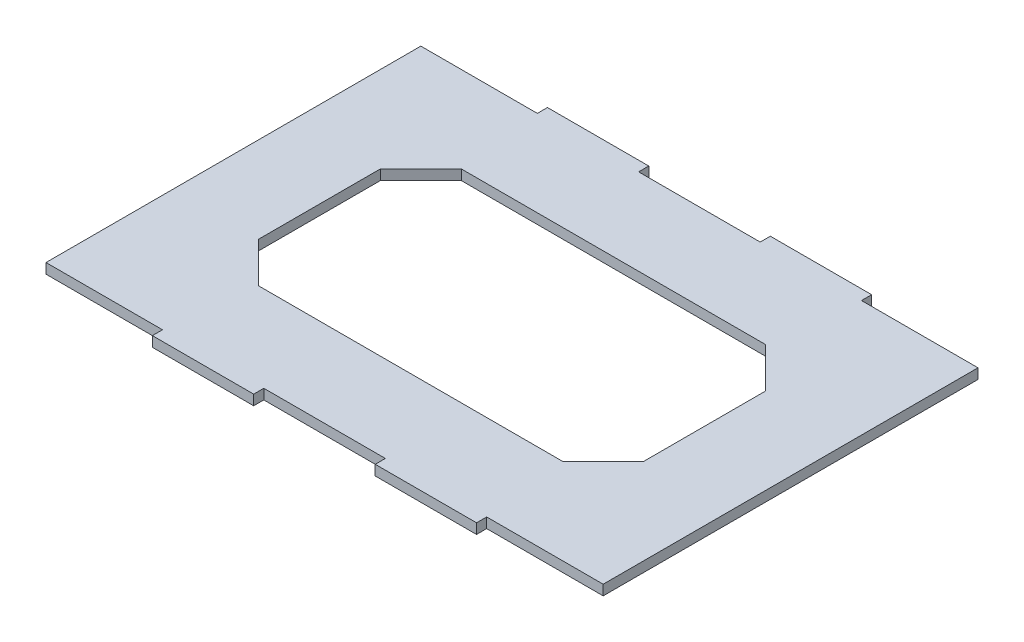
ISO-10303-21;
HEADER;
FILE_DESCRIPTION(('STEP AP214'),'2;1');
FILE_NAME('part.step','',(''),(''),'','','');
FILE_SCHEMA(('AUTOMOTIVE_DESIGN { 1 0 10303 214 1 1 1 1 }'));
ENDSEC;
DATA;
#1=APPLICATION_CONTEXT('core data for automotive mechanical design processes');
#2=APPLICATION_PROTOCOL_DEFINITION('international standard','automotive_design',2000,#1);
#3=PRODUCT_CONTEXT('',#1,'mechanical');
#4=PRODUCT('Part','Part','',(#3));
#5=PRODUCT_RELATED_PRODUCT_CATEGORY('part','',(#4));
#6=PRODUCT_DEFINITION_FORMATION('','',#4);
#7=PRODUCT_DEFINITION_CONTEXT('part definition',#1,'design');
#8=PRODUCT_DEFINITION('design','',#6,#7);
#9=PRODUCT_DEFINITION_SHAPE('','',#8);
#10=(LENGTH_UNIT() NAMED_UNIT(*) SI_UNIT(.MILLI.,.METRE.));
#11=(NAMED_UNIT(*) PLANE_ANGLE_UNIT() SI_UNIT($,.RADIAN.));
#12=(NAMED_UNIT(*) SI_UNIT($,.STERADIAN.) SOLID_ANGLE_UNIT());
#13=UNCERTAINTY_MEASURE_WITH_UNIT(LENGTH_MEASURE(1.E-05),#10,'distance_accuracy_value','');
#14=(GEOMETRIC_REPRESENTATION_CONTEXT(3) GLOBAL_UNCERTAINTY_ASSIGNED_CONTEXT((#13)) GLOBAL_UNIT_ASSIGNED_CONTEXT((#10,
#11,#12)) REPRESENTATION_CONTEXT('',''));
#15=CARTESIAN_POINT('',(0.,0.,0.));
#16=DIRECTION('',(0.,0.,1.));
#17=DIRECTION('',(1.,0.,0.));
#18=AXIS2_PLACEMENT_3D('',#15,#16,#17);
#19=CARTESIAN_POINT('',(0.,10.,0.));
#20=DIRECTION('',(0.,1.,0.));
#21=DIRECTION('',(0.,0.,1.));
#22=AXIS2_PLACEMENT_3D('',#19,#20,#21);
#23=PLANE('',#22);
#24=DIRECTION('',(0.,0.,-1.));
#25=VECTOR('',#24,1.);
#26=CARTESIAN_POINT('',(550.,10.,-380.));
#27=LINE('',#26,#25);
#28=CARTESIAN_POINT('',(550.,10.,-10.));
#29=VERTEX_POINT('',#28);
#30=CARTESIAN_POINT('',(550.,10.,-380.));
#31=VERTEX_POINT('',#30);
#32=EDGE_CURVE('E283',#29,#31,#27,.T.);
#33=ORIENTED_EDGE('',*,*,#32,.T.);
#34=DIRECTION('',(-1.,0.,0.));
#35=VECTOR('',#34,1.);
#36=CARTESIAN_POINT('',(435.,10.,-380.));
#37=LINE('',#36,#35);
#38=CARTESIAN_POINT('',(435.,10.,-380.));
#39=VERTEX_POINT('',#38);
#40=EDGE_CURVE('E286',#31,#39,#37,.T.);
#41=ORIENTED_EDGE('',*,*,#40,.T.);
#42=DIRECTION('',(0.,0.,-1.));
#43=VECTOR('',#42,1.);
#44=CARTESIAN_POINT('',(435.,10.,-390.));
#45=LINE('',#44,#43);
#46=CARTESIAN_POINT('',(435.,10.,-390.));
#47=VERTEX_POINT('',#46);
#48=EDGE_CURVE('E289',#39,#47,#45,.T.);
#49=ORIENTED_EDGE('',*,*,#48,.T.);
#50=DIRECTION('',(-1.,0.,0.));
#51=VECTOR('',#50,1.);
#52=CARTESIAN_POINT('',(335.,10.,-390.));
#53=LINE('',#52,#51);
#54=CARTESIAN_POINT('',(335.,10.,-390.));
#55=VERTEX_POINT('',#54);
#56=EDGE_CURVE('E291',#47,#55,#53,.T.);
#57=ORIENTED_EDGE('',*,*,#56,.T.);
#58=DIRECTION('',(0.,0.,1.));
#59=VECTOR('',#58,1.);
#60=CARTESIAN_POINT('',(335.,10.,-380.));
#61=LINE('',#60,#59);
#62=CARTESIAN_POINT('',(335.,10.,-380.));
#63=VERTEX_POINT('',#62);
#64=EDGE_CURVE('E293',#55,#63,#61,.T.);
#65=ORIENTED_EDGE('',*,*,#64,.T.);
#66=DIRECTION('',(-1.,0.,0.));
#67=VECTOR('',#66,1.);
#68=CARTESIAN_POINT('',(215.,10.,-380.));
#69=LINE('',#68,#67);
#70=CARTESIAN_POINT('',(215.,10.,-380.));
#71=VERTEX_POINT('',#70);
#72=EDGE_CURVE('E295',#63,#71,#69,.T.);
#73=ORIENTED_EDGE('',*,*,#72,.T.);
#74=DIRECTION('',(0.,0.,-1.));
#75=VECTOR('',#74,1.);
#76=CARTESIAN_POINT('',(215.,10.,-390.));
#77=LINE('',#76,#75);
#78=CARTESIAN_POINT('',(215.,10.,-390.));
#79=VERTEX_POINT('',#78);
#80=EDGE_CURVE('E297',#71,#79,#77,.T.);
#81=ORIENTED_EDGE('',*,*,#80,.T.);
#82=DIRECTION('',(-1.,0.,0.));
#83=VECTOR('',#82,1.);
#84=CARTESIAN_POINT('',(115.,10.,-390.));
#85=LINE('',#84,#83);
#86=CARTESIAN_POINT('',(115.,10.,-390.));
#87=VERTEX_POINT('',#86);
#88=EDGE_CURVE('E299',#79,#87,#85,.T.);
#89=ORIENTED_EDGE('',*,*,#88,.T.);
#90=DIRECTION('',(0.,0.,1.));
#91=VECTOR('',#90,1.);
#92=CARTESIAN_POINT('',(115.,10.,-380.));
#93=LINE('',#92,#91);
#94=CARTESIAN_POINT('',(115.,10.,-380.));
#95=VERTEX_POINT('',#94);
#96=EDGE_CURVE('E301',#87,#95,#93,.T.);
#97=ORIENTED_EDGE('',*,*,#96,.T.);
#98=DIRECTION('',(-1.,0.,0.));
#99=VECTOR('',#98,1.);
#100=CARTESIAN_POINT('',(-1.11022302462516E-13,10.,-380.));
#101=LINE('',#100,#99);
#102=CARTESIAN_POINT('',(-1.11022302462516E-13,10.,-380.));
#103=VERTEX_POINT('',#102);
#104=EDGE_CURVE('E303',#95,#103,#101,.T.);
#105=ORIENTED_EDGE('',*,*,#104,.T.);
#106=DIRECTION('',(0.,0.,1.));
#107=VECTOR('',#106,1.);
#108=CARTESIAN_POINT('',(0.,10.,-9.99999999999997));
#109=LINE('',#108,#107);
#110=CARTESIAN_POINT('',(0.,10.,-9.99999999999997));
#111=VERTEX_POINT('',#110);
#112=EDGE_CURVE('E305',#103,#111,#109,.T.);
#113=ORIENTED_EDGE('',*,*,#112,.T.);
#114=DIRECTION('',(1.,0.,0.));
#115=VECTOR('',#114,1.);
#116=CARTESIAN_POINT('',(0.,10.,-9.99999999999997));
#117=LINE('',#116,#115);
#118=CARTESIAN_POINT('',(115.,10.,-10.));
#119=VERTEX_POINT('',#118);
#120=EDGE_CURVE('E307',#111,#119,#117,.T.);
#121=ORIENTED_EDGE('',*,*,#120,.T.);
#122=DIRECTION('',(0.,0.,1.));
#123=VECTOR('',#122,1.);
#124=CARTESIAN_POINT('',(115.,10.,-10.));
#125=LINE('',#124,#123);
#126=CARTESIAN_POINT('',(115.,10.,0.));
#127=VERTEX_POINT('',#126);
#128=EDGE_CURVE('E309',#119,#127,#125,.T.);
#129=ORIENTED_EDGE('',*,*,#128,.T.);
#130=DIRECTION('',(1.,0.,0.));
#131=VECTOR('',#130,1.);
#132=CARTESIAN_POINT('',(115.,10.,0.));
#133=LINE('',#132,#131);
#134=CARTESIAN_POINT('',(215.,10.,0.));
#135=VERTEX_POINT('',#134);
#136=EDGE_CURVE('E311',#127,#135,#133,.T.);
#137=ORIENTED_EDGE('',*,*,#136,.T.);
#138=DIRECTION('',(0.,0.,-1.));
#139=VECTOR('',#138,1.);
#140=CARTESIAN_POINT('',(215.,10.,0.));
#141=LINE('',#140,#139);
#142=CARTESIAN_POINT('',(215.,10.,-9.99999999999996));
#143=VERTEX_POINT('',#142);
#144=EDGE_CURVE('E313',#135,#143,#141,.T.);
#145=ORIENTED_EDGE('',*,*,#144,.T.);
#146=DIRECTION('',(1.,0.,0.));
#147=VECTOR('',#146,1.);
#148=CARTESIAN_POINT('',(215.,10.,-9.99999999999996));
#149=LINE('',#148,#147);
#150=CARTESIAN_POINT('',(335.,10.,-9.99999999999997));
#151=VERTEX_POINT('',#150);
#152=EDGE_CURVE('E315',#143,#151,#149,.T.);
#153=ORIENTED_EDGE('',*,*,#152,.T.);
#154=DIRECTION('',(0.,0.,1.));
#155=VECTOR('',#154,1.);
#156=CARTESIAN_POINT('',(335.,10.,-9.99999999999997));
#157=LINE('',#156,#155);
#158=CARTESIAN_POINT('',(335.,10.,0.));
#159=VERTEX_POINT('',#158);
#160=EDGE_CURVE('E317',#151,#159,#157,.T.);
#161=ORIENTED_EDGE('',*,*,#160,.T.);
#162=DIRECTION('',(1.,0.,0.));
#163=VECTOR('',#162,1.);
#164=CARTESIAN_POINT('',(335.,10.,0.));
#165=LINE('',#164,#163);
#166=CARTESIAN_POINT('',(435.,10.,0.));
#167=VERTEX_POINT('',#166);
#168=EDGE_CURVE('E319',#159,#167,#165,.T.);
#169=ORIENTED_EDGE('',*,*,#168,.T.);
#170=DIRECTION('',(0.,0.,-1.));
#171=VECTOR('',#170,1.);
#172=CARTESIAN_POINT('',(435.,10.,0.));
#173=LINE('',#172,#171);
#174=CARTESIAN_POINT('',(435.,10.,-9.99999999999999));
#175=VERTEX_POINT('',#174);
#176=EDGE_CURVE('E321',#167,#175,#173,.T.);
#177=ORIENTED_EDGE('',*,*,#176,.T.);
#178=DIRECTION('',(1.,0.,0.));
#179=VECTOR('',#178,1.);
#180=CARTESIAN_POINT('',(435.,10.,-9.99999999999999));
#181=LINE('',#180,#179);
#182=EDGE_CURVE('E323',#175,#29,#181,.T.);
#183=ORIENTED_EDGE('',*,*,#182,.T.);
#184=EDGE_LOOP('',(#33,#41,#49,#57,#65,#73,#81,#89,#97,#105,#113,#121,#129,#137,#145,#153,#161,
#169,#177,#183));
#185=FACE_BOUND('',#184,.T.);
#186=DIRECTION('',(0.707106781186547,0.,-0.707106781186548));
#187=VECTOR('',#186,1.);
#188=CARTESIAN_POINT('',(425.,10.,-95.));
#189=LINE('',#188,#187);
#190=CARTESIAN_POINT('',(425.,10.,-95.));
#191=VERTEX_POINT('',#190);
#192=CARTESIAN_POINT('',(465.,10.,-135.));
#193=VERTEX_POINT('',#192);
#194=EDGE_CURVE('E226',#191,#193,#189,.T.);
#195=ORIENTED_EDGE('',*,*,#194,.F.);
#196=DIRECTION('',(1.,0.,0.));
#197=VECTOR('',#196,1.);
#198=CARTESIAN_POINT('',(125.,10.,-95.));
#199=LINE('',#198,#197);
#200=CARTESIAN_POINT('',(125.,10.,-95.));
#201=VERTEX_POINT('',#200);
#202=EDGE_CURVE('E218',#201,#191,#199,.T.);
#203=ORIENTED_EDGE('',*,*,#202,.F.);
#204=DIRECTION('',(0.707106781186547,0.,0.707106781186548));
#205=VECTOR('',#204,1.);
#206=CARTESIAN_POINT('',(85.,10.,-135.));
#207=LINE('',#206,#205);
#208=CARTESIAN_POINT('',(85.,10.,-135.));
#209=VERTEX_POINT('',#208);
#210=EDGE_CURVE('E251',#209,#201,#207,.T.);
#211=ORIENTED_EDGE('',*,*,#210,.F.);
#212=DIRECTION('',(0.,0.,1.));
#213=VECTOR('',#212,1.);
#214=CARTESIAN_POINT('',(85.,10.,-255.));
#215=LINE('',#214,#213);
#216=CARTESIAN_POINT('',(85.,10.,-255.));
#217=VERTEX_POINT('',#216);
#218=EDGE_CURVE('E249',#217,#209,#215,.T.);
#219=ORIENTED_EDGE('',*,*,#218,.F.);
#220=DIRECTION('',(-0.707106781186548,0.,0.707106781186547));
#221=VECTOR('',#220,1.);
#222=CARTESIAN_POINT('',(85.,10.,-255.));
#223=LINE('',#222,#221);
#224=CARTESIAN_POINT('',(125.,10.,-295.));
#225=VERTEX_POINT('',#224);
#226=EDGE_CURVE('E247',#225,#217,#223,.T.);
#227=ORIENTED_EDGE('',*,*,#226,.F.);
#228=DIRECTION('',(-1.,0.,0.));
#229=VECTOR('',#228,1.);
#230=CARTESIAN_POINT('',(125.,10.,-295.));
#231=LINE('',#230,#229);
#232=CARTESIAN_POINT('',(425.,10.,-295.));
#233=VERTEX_POINT('',#232);
#234=EDGE_CURVE('E245',#233,#225,#231,.T.);
#235=ORIENTED_EDGE('',*,*,#234,.F.);
#236=DIRECTION('',(-0.707106781186547,0.,-0.707106781186547));
#237=VECTOR('',#236,1.);
#238=CARTESIAN_POINT('',(425.,10.,-295.));
#239=LINE('',#238,#237);
#240=CARTESIAN_POINT('',(465.,10.,-255.));
#241=VERTEX_POINT('',#240);
#242=EDGE_CURVE('E241',#241,#233,#239,.T.);
#243=ORIENTED_EDGE('',*,*,#242,.F.);
#244=DIRECTION('',(0.,0.,-1.));
#245=VECTOR('',#244,1.);
#246=CARTESIAN_POINT('',(465.,10.,-255.));
#247=LINE('',#246,#245);
#248=EDGE_CURVE('E239',#193,#241,#247,.T.);
#249=ORIENTED_EDGE('',*,*,#248,.F.);
#250=EDGE_LOOP('',(#195,#203,#211,#219,#227,#235,#243,#249));
#251=FACE_BOUND('',#250,.T.);
#252=ADVANCED_FACE('F33',(#185,#251),#23,.T.);
#253=CARTESIAN_POINT('',(0.,0.,0.));
#254=DIRECTION('',(0.,1.,0.));
#255=DIRECTION('',(0.,0.,1.));
#256=AXIS2_PLACEMENT_3D('',#253,#254,#255);
#257=PLANE('',#256);
#258=DIRECTION('',(0.,0.,-1.));
#259=VECTOR('',#258,1.);
#260=CARTESIAN_POINT('',(550.,0.,-380.));
#261=LINE('',#260,#259);
#262=CARTESIAN_POINT('',(550.,0.,-10.));
#263=VERTEX_POINT('',#262);
#264=CARTESIAN_POINT('',(550.,0.,-380.));
#265=VERTEX_POINT('',#264);
#266=EDGE_CURVE('E234',#263,#265,#261,.T.);
#267=ORIENTED_EDGE('',*,*,#266,.F.);
#268=DIRECTION('',(1.,0.,0.));
#269=VECTOR('',#268,1.);
#270=CARTESIAN_POINT('',(435.,0.,-9.99999999999999));
#271=LINE('',#270,#269);
#272=CARTESIAN_POINT('',(435.,0.,-9.99999999999999));
#273=VERTEX_POINT('',#272);
#274=EDGE_CURVE('E287',#273,#263,#271,.T.);
#275=ORIENTED_EDGE('',*,*,#274,.F.);
#276=DIRECTION('',(0.,0.,-1.));
#277=VECTOR('',#276,1.);
#278=CARTESIAN_POINT('',(435.,0.,0.));
#279=LINE('',#278,#277);
#280=CARTESIAN_POINT('',(435.,0.,0.));
#281=VERTEX_POINT('',#280);
#282=EDGE_CURVE('E362',#281,#273,#279,.T.);
#283=ORIENTED_EDGE('',*,*,#282,.F.);
#284=DIRECTION('',(1.,0.,0.));
#285=VECTOR('',#284,1.);
#286=CARTESIAN_POINT('',(335.,0.,0.));
#287=LINE('',#286,#285);
#288=CARTESIAN_POINT('',(335.,0.,0.));
#289=VERTEX_POINT('',#288);
#290=EDGE_CURVE('E360',#289,#281,#287,.T.);
#291=ORIENTED_EDGE('',*,*,#290,.F.);
#292=DIRECTION('',(0.,0.,1.));
#293=VECTOR('',#292,1.);
#294=CARTESIAN_POINT('',(335.,0.,-9.99999999999997));
#295=LINE('',#294,#293);
#296=CARTESIAN_POINT('',(335.,0.,-9.99999999999997));
#297=VERTEX_POINT('',#296);
#298=EDGE_CURVE('E358',#297,#289,#295,.T.);
#299=ORIENTED_EDGE('',*,*,#298,.F.);
#300=DIRECTION('',(1.,0.,0.));
#301=VECTOR('',#300,1.);
#302=CARTESIAN_POINT('',(215.,0.,-9.99999999999996));
#303=LINE('',#302,#301);
#304=CARTESIAN_POINT('',(215.,0.,-9.99999999999996));
#305=VERTEX_POINT('',#304);
#306=EDGE_CURVE('E356',#305,#297,#303,.T.);
#307=ORIENTED_EDGE('',*,*,#306,.F.);
#308=DIRECTION('',(0.,0.,-1.));
#309=VECTOR('',#308,1.);
#310=CARTESIAN_POINT('',(215.,0.,0.));
#311=LINE('',#310,#309);
#312=CARTESIAN_POINT('',(215.,0.,0.));
#313=VERTEX_POINT('',#312);
#314=EDGE_CURVE('E354',#313,#305,#311,.T.);
#315=ORIENTED_EDGE('',*,*,#314,.F.);
#316=DIRECTION('',(1.,0.,0.));
#317=VECTOR('',#316,1.);
#318=CARTESIAN_POINT('',(115.,0.,0.));
#319=LINE('',#318,#317);
#320=CARTESIAN_POINT('',(115.,0.,0.));
#321=VERTEX_POINT('',#320);
#322=EDGE_CURVE('E352',#321,#313,#319,.T.);
#323=ORIENTED_EDGE('',*,*,#322,.F.);
#324=DIRECTION('',(0.,0.,1.));
#325=VECTOR('',#324,1.);
#326=CARTESIAN_POINT('',(115.,0.,-10.));
#327=LINE('',#326,#325);
#328=CARTESIAN_POINT('',(115.,0.,-10.));
#329=VERTEX_POINT('',#328);
#330=EDGE_CURVE('E350',#329,#321,#327,.T.);
#331=ORIENTED_EDGE('',*,*,#330,.F.);
#332=DIRECTION('',(1.,0.,0.));
#333=VECTOR('',#332,1.);
#334=CARTESIAN_POINT('',(0.,0.,-9.99999999999997));
#335=LINE('',#334,#333);
#336=CARTESIAN_POINT('',(0.,0.,-9.99999999999997));
#337=VERTEX_POINT('',#336);
#338=EDGE_CURVE('E348',#337,#329,#335,.T.);
#339=ORIENTED_EDGE('',*,*,#338,.F.);
#340=DIRECTION('',(0.,0.,1.));
#341=VECTOR('',#340,1.);
#342=CARTESIAN_POINT('',(0.,0.,-9.99999999999997));
#343=LINE('',#342,#341);
#344=CARTESIAN_POINT('',(-1.11022302462516E-13,0.,-380.));
#345=VERTEX_POINT('',#344);
#346=EDGE_CURVE('E346',#345,#337,#343,.T.);
#347=ORIENTED_EDGE('',*,*,#346,.F.);
#348=DIRECTION('',(-1.,0.,0.));
#349=VECTOR('',#348,1.);
#350=CARTESIAN_POINT('',(-1.11022302462516E-13,0.,-380.));
#351=LINE('',#350,#349);
#352=CARTESIAN_POINT('',(115.,0.,-380.));
#353=VERTEX_POINT('',#352);
#354=EDGE_CURVE('E344',#353,#345,#351,.T.);
#355=ORIENTED_EDGE('',*,*,#354,.F.);
#356=DIRECTION('',(0.,0.,1.));
#357=VECTOR('',#356,1.);
#358=CARTESIAN_POINT('',(115.,0.,-380.));
#359=LINE('',#358,#357);
#360=CARTESIAN_POINT('',(115.,0.,-390.));
#361=VERTEX_POINT('',#360);
#362=EDGE_CURVE('E342',#361,#353,#359,.T.);
#363=ORIENTED_EDGE('',*,*,#362,.F.);
#364=DIRECTION('',(-1.,0.,0.));
#365=VECTOR('',#364,1.);
#366=CARTESIAN_POINT('',(115.,0.,-390.));
#367=LINE('',#366,#365);
#368=CARTESIAN_POINT('',(215.,0.,-390.));
#369=VERTEX_POINT('',#368);
#370=EDGE_CURVE('E340',#369,#361,#367,.T.);
#371=ORIENTED_EDGE('',*,*,#370,.F.);
#372=DIRECTION('',(0.,0.,-1.));
#373=VECTOR('',#372,1.);
#374=CARTESIAN_POINT('',(215.,0.,-390.));
#375=LINE('',#374,#373);
#376=CARTESIAN_POINT('',(215.,0.,-380.));
#377=VERTEX_POINT('',#376);
#378=EDGE_CURVE('E338',#377,#369,#375,.T.);
#379=ORIENTED_EDGE('',*,*,#378,.F.);
#380=DIRECTION('',(-1.,0.,0.));
#381=VECTOR('',#380,1.);
#382=CARTESIAN_POINT('',(215.,0.,-380.));
#383=LINE('',#382,#381);
#384=CARTESIAN_POINT('',(335.,0.,-380.));
#385=VERTEX_POINT('',#384);
#386=EDGE_CURVE('E336',#385,#377,#383,.T.);
#387=ORIENTED_EDGE('',*,*,#386,.F.);
#388=DIRECTION('',(0.,0.,1.));
#389=VECTOR('',#388,1.);
#390=CARTESIAN_POINT('',(335.,0.,-380.));
#391=LINE('',#390,#389);
#392=CARTESIAN_POINT('',(335.,0.,-390.));
#393=VERTEX_POINT('',#392);
#394=EDGE_CURVE('E334',#393,#385,#391,.T.);
#395=ORIENTED_EDGE('',*,*,#394,.F.);
#396=DIRECTION('',(-1.,0.,0.));
#397=VECTOR('',#396,1.);
#398=CARTESIAN_POINT('',(335.,0.,-390.));
#399=LINE('',#398,#397);
#400=CARTESIAN_POINT('',(435.,0.,-390.));
#401=VERTEX_POINT('',#400);
#402=EDGE_CURVE('E332',#401,#393,#399,.T.);
#403=ORIENTED_EDGE('',*,*,#402,.F.);
#404=DIRECTION('',(0.,0.,-1.));
#405=VECTOR('',#404,1.);
#406=CARTESIAN_POINT('',(435.,0.,-390.));
#407=LINE('',#406,#405);
#408=CARTESIAN_POINT('',(435.,0.,-380.));
#409=VERTEX_POINT('',#408);
#410=EDGE_CURVE('E330',#409,#401,#407,.T.);
#411=ORIENTED_EDGE('',*,*,#410,.F.);
#412=DIRECTION('',(-1.,0.,0.));
#413=VECTOR('',#412,1.);
#414=CARTESIAN_POINT('',(435.,0.,-380.));
#415=LINE('',#414,#413);
#416=EDGE_CURVE('E328',#265,#409,#415,.T.);
#417=ORIENTED_EDGE('',*,*,#416,.F.);
#418=EDGE_LOOP('',(#267,#275,#283,#291,#299,#307,#315,#323,#331,#339,#347,#355,#363,#371,#379,
#387,#395,#403,#411,#417));
#419=FACE_BOUND('',#418,.T.);
#420=DIRECTION('',(1.,0.,0.));
#421=VECTOR('',#420,1.);
#422=CARTESIAN_POINT('',(125.,0.,-95.));
#423=LINE('',#422,#421);
#424=CARTESIAN_POINT('',(125.,0.,-95.));
#425=VERTEX_POINT('',#424);
#426=CARTESIAN_POINT('',(425.,0.,-95.));
#427=VERTEX_POINT('',#426);
#428=EDGE_CURVE('E56',#425,#427,#423,.T.);
#429=ORIENTED_EDGE('',*,*,#428,.T.);
#430=DIRECTION('',(0.707106781186547,0.,-0.707106781186548));
#431=VECTOR('',#430,1.);
#432=CARTESIAN_POINT('',(425.,0.,-95.));
#433=LINE('',#432,#431);
#434=CARTESIAN_POINT('',(465.,0.,-135.));
#435=VERTEX_POINT('',#434);
#436=EDGE_CURVE('E233',#427,#435,#433,.T.);
#437=ORIENTED_EDGE('',*,*,#436,.T.);
#438=DIRECTION('',(0.,0.,-1.));
#439=VECTOR('',#438,1.);
#440=CARTESIAN_POINT('',(465.,0.,-255.));
#441=LINE('',#440,#439);
#442=CARTESIAN_POINT('',(465.,0.,-255.));
#443=VERTEX_POINT('',#442);
#444=EDGE_CURVE('E255',#435,#443,#441,.T.);
#445=ORIENTED_EDGE('',*,*,#444,.T.);
#446=DIRECTION('',(-0.707106781186547,0.,-0.707106781186547));
#447=VECTOR('',#446,1.);
#448=CARTESIAN_POINT('',(425.,0.,-295.));
#449=LINE('',#448,#447);
#450=CARTESIAN_POINT('',(425.,0.,-295.));
#451=VERTEX_POINT('',#450);
#452=EDGE_CURVE('E258',#443,#451,#449,.T.);
#453=ORIENTED_EDGE('',*,*,#452,.T.);
#454=DIRECTION('',(-1.,0.,0.));
#455=VECTOR('',#454,1.);
#456=CARTESIAN_POINT('',(125.,0.,-295.));
#457=LINE('',#456,#455);
#458=CARTESIAN_POINT('',(125.,0.,-295.));
#459=VERTEX_POINT('',#458);
#460=EDGE_CURVE('E261',#451,#459,#457,.T.);
#461=ORIENTED_EDGE('',*,*,#460,.T.);
#462=DIRECTION('',(-0.707106781186548,0.,0.707106781186547));
#463=VECTOR('',#462,1.);
#464=CARTESIAN_POINT('',(85.,0.,-255.));
#465=LINE('',#464,#463);
#466=CARTESIAN_POINT('',(85.,0.,-255.));
#467=VERTEX_POINT('',#466);
#468=EDGE_CURVE('E264',#459,#467,#465,.T.);
#469=ORIENTED_EDGE('',*,*,#468,.T.);
#470=DIRECTION('',(0.,0.,1.));
#471=VECTOR('',#470,1.);
#472=CARTESIAN_POINT('',(85.,0.,-255.));
#473=LINE('',#472,#471);
#474=CARTESIAN_POINT('',(85.,0.,-135.));
#475=VERTEX_POINT('',#474);
#476=EDGE_CURVE('E267',#467,#475,#473,.T.);
#477=ORIENTED_EDGE('',*,*,#476,.T.);
#478=DIRECTION('',(0.707106781186547,0.,0.707106781186548));
#479=VECTOR('',#478,1.);
#480=CARTESIAN_POINT('',(85.,0.,-135.));
#481=LINE('',#480,#479);
#482=EDGE_CURVE('E227',#475,#425,#481,.T.);
#483=ORIENTED_EDGE('',*,*,#482,.T.);
#484=EDGE_LOOP('',(#429,#437,#445,#453,#461,#469,#477,#483));
#485=FACE_BOUND('',#484,.T.);
#486=ADVANCED_FACE('F428',(#419,#485),#257,.F.);
#487=CARTESIAN_POINT('',(550.,10.,-380.));
#488=DIRECTION('',(-1.,0.,0.));
#489=DIRECTION('',(0.,0.,1.));
#490=AXIS2_PLACEMENT_3D('',#487,#488,#489);
#491=PLANE('',#490);
#492=ORIENTED_EDGE('',*,*,#266,.T.);
#493=DIRECTION('',(0.,-1.,0.));
#494=VECTOR('',#493,1.);
#495=CARTESIAN_POINT('',(550.,10.,-380.));
#496=LINE('',#495,#494);
#497=EDGE_CURVE('E11',#31,#265,#496,.T.);
#498=ORIENTED_EDGE('',*,*,#497,.F.);
#499=ORIENTED_EDGE('',*,*,#32,.F.);
#500=DIRECTION('',(0.,-1.,0.));
#501=VECTOR('',#500,1.);
#502=CARTESIAN_POINT('',(550.,10.,-10.));
#503=LINE('',#502,#501);
#504=EDGE_CURVE('E325',#29,#263,#503,.T.);
#505=ORIENTED_EDGE('',*,*,#504,.T.);
#506=EDGE_LOOP('',(#492,#498,#499,#505));
#507=FACE_BOUND('',#506,.T.);
#508=ADVANCED_FACE('F35',(#507),#491,.F.);
#509=CARTESIAN_POINT('',(435.,10.,-380.));
#510=DIRECTION('',(0.,0.,1.));
#511=DIRECTION('',(1.,0.,0.));
#512=AXIS2_PLACEMENT_3D('',#509,#510,#511);
#513=PLANE('',#512);
#514=ORIENTED_EDGE('',*,*,#416,.T.);
#515=DIRECTION('',(0.,-1.,0.));
#516=VECTOR('',#515,1.);
#517=CARTESIAN_POINT('',(435.,10.,-380.));
#518=LINE('',#517,#516);
#519=EDGE_CURVE('E41',#39,#409,#518,.T.);
#520=ORIENTED_EDGE('',*,*,#519,.F.);
#521=ORIENTED_EDGE('',*,*,#40,.F.);
#522=ORIENTED_EDGE('',*,*,#497,.T.);
#523=EDGE_LOOP('',(#514,#520,#521,#522));
#524=FACE_BOUND('',#523,.T.);
#525=ADVANCED_FACE('F445',(#524),#513,.F.);
#526=CARTESIAN_POINT('',(435.,10.,-390.));
#527=DIRECTION('',(-1.,0.,0.));
#528=DIRECTION('',(0.,0.,1.));
#529=AXIS2_PLACEMENT_3D('',#526,#527,#528);
#530=PLANE('',#529);
#531=ORIENTED_EDGE('',*,*,#410,.T.);
#532=DIRECTION('',(0.,-1.,0.));
#533=VECTOR('',#532,1.);
#534=CARTESIAN_POINT('',(435.,10.,-390.));
#535=LINE('',#534,#533);
#536=EDGE_CURVE('E415',#47,#401,#535,.T.);
#537=ORIENTED_EDGE('',*,*,#536,.F.);
#538=ORIENTED_EDGE('',*,*,#48,.F.);
#539=ORIENTED_EDGE('',*,*,#519,.T.);
#540=EDGE_LOOP('',(#531,#537,#538,#539));
#541=FACE_BOUND('',#540,.T.);
#542=ADVANCED_FACE('F422',(#541),#530,.F.);
#543=CARTESIAN_POINT('',(335.,10.,-390.));
#544=DIRECTION('',(0.,0.,1.));
#545=DIRECTION('',(1.,0.,0.));
#546=AXIS2_PLACEMENT_3D('',#543,#544,#545);
#547=PLANE('',#546);
#548=ORIENTED_EDGE('',*,*,#402,.T.);
#549=DIRECTION('',(0.,-1.,0.));
#550=VECTOR('',#549,1.);
#551=CARTESIAN_POINT('',(335.,10.,-390.));
#552=LINE('',#551,#550);
#553=EDGE_CURVE('E412',#55,#393,#552,.T.);
#554=ORIENTED_EDGE('',*,*,#553,.F.);
#555=ORIENTED_EDGE('',*,*,#56,.F.);
#556=ORIENTED_EDGE('',*,*,#536,.T.);
#557=EDGE_LOOP('',(#548,#554,#555,#556));
#558=FACE_BOUND('',#557,.T.);
#559=ADVANCED_FACE('F434',(#558),#547,.F.);
#560=CARTESIAN_POINT('',(335.,10.,-380.));
#561=DIRECTION('',(1.,0.,0.));
#562=DIRECTION('',(0.,0.,-1.));
#563=AXIS2_PLACEMENT_3D('',#560,#561,#562);
#564=PLANE('',#563);
#565=ORIENTED_EDGE('',*,*,#394,.T.);
#566=DIRECTION('',(0.,-1.,0.));
#567=VECTOR('',#566,1.);
#568=CARTESIAN_POINT('',(335.,10.,-380.));
#569=LINE('',#568,#567);
#570=EDGE_CURVE('E409',#63,#385,#569,.T.);
#571=ORIENTED_EDGE('',*,*,#570,.F.);
#572=ORIENTED_EDGE('',*,*,#64,.F.);
#573=ORIENTED_EDGE('',*,*,#553,.T.);
#574=EDGE_LOOP('',(#565,#571,#572,#573));
#575=FACE_BOUND('',#574,.T.);
#576=ADVANCED_FACE('F438',(#575),#564,.F.);
#577=CARTESIAN_POINT('',(215.,10.,-380.));
#578=DIRECTION('',(0.,0.,1.));
#579=DIRECTION('',(1.,0.,0.));
#580=AXIS2_PLACEMENT_3D('',#577,#578,#579);
#581=PLANE('',#580);
#582=ORIENTED_EDGE('',*,*,#386,.T.);
#583=DIRECTION('',(0.,-1.,0.));
#584=VECTOR('',#583,1.);
#585=CARTESIAN_POINT('',(215.,10.,-380.));
#586=LINE('',#585,#584);
#587=EDGE_CURVE('E406',#71,#377,#586,.T.);
#588=ORIENTED_EDGE('',*,*,#587,.F.);
#589=ORIENTED_EDGE('',*,*,#72,.F.);
#590=ORIENTED_EDGE('',*,*,#570,.T.);
#591=EDGE_LOOP('',(#582,#588,#589,#590));
#592=FACE_BOUND('',#591,.T.);
#593=ADVANCED_FACE('F518',(#592),#581,.F.);
#594=CARTESIAN_POINT('',(215.,10.,-390.));
#595=DIRECTION('',(-1.,0.,0.));
#596=DIRECTION('',(0.,0.,1.));
#597=AXIS2_PLACEMENT_3D('',#594,#595,#596);
#598=PLANE('',#597);
#599=ORIENTED_EDGE('',*,*,#378,.T.);
#600=DIRECTION('',(0.,-1.,0.));
#601=VECTOR('',#600,1.);
#602=CARTESIAN_POINT('',(215.,10.,-390.));
#603=LINE('',#602,#601);
#604=EDGE_CURVE('E403',#79,#369,#603,.T.);
#605=ORIENTED_EDGE('',*,*,#604,.F.);
#606=ORIENTED_EDGE('',*,*,#80,.F.);
#607=ORIENTED_EDGE('',*,*,#587,.T.);
#608=EDGE_LOOP('',(#599,#605,#606,#607));
#609=FACE_BOUND('',#608,.T.);
#610=ADVANCED_FACE('F516',(#609),#598,.F.);
#611=CARTESIAN_POINT('',(115.,10.,-390.));
#612=DIRECTION('',(0.,0.,1.));
#613=DIRECTION('',(1.,0.,0.));
#614=AXIS2_PLACEMENT_3D('',#611,#612,#613);
#615=PLANE('',#614);
#616=ORIENTED_EDGE('',*,*,#370,.T.);
#617=DIRECTION('',(0.,-1.,0.));
#618=VECTOR('',#617,1.);
#619=CARTESIAN_POINT('',(115.,10.,-390.));
#620=LINE('',#619,#618);
#621=EDGE_CURVE('E400',#87,#361,#620,.T.);
#622=ORIENTED_EDGE('',*,*,#621,.F.);
#623=ORIENTED_EDGE('',*,*,#88,.F.);
#624=ORIENTED_EDGE('',*,*,#604,.T.);
#625=EDGE_LOOP('',(#616,#622,#623,#624));
#626=FACE_BOUND('',#625,.T.);
#627=ADVANCED_FACE('F511',(#626),#615,.F.);
#628=CARTESIAN_POINT('',(115.,10.,-380.));
#629=DIRECTION('',(1.,0.,0.));
#630=DIRECTION('',(0.,0.,-1.));
#631=AXIS2_PLACEMENT_3D('',#628,#629,#630);
#632=PLANE('',#631);
#633=ORIENTED_EDGE('',*,*,#362,.T.);
#634=DIRECTION('',(0.,-1.,0.));
#635=VECTOR('',#634,1.);
#636=CARTESIAN_POINT('',(115.,10.,-380.));
#637=LINE('',#636,#635);
#638=EDGE_CURVE('E397',#95,#353,#637,.T.);
#639=ORIENTED_EDGE('',*,*,#638,.F.);
#640=ORIENTED_EDGE('',*,*,#96,.F.);
#641=ORIENTED_EDGE('',*,*,#621,.T.);
#642=EDGE_LOOP('',(#633,#639,#640,#641));
#643=FACE_BOUND('',#642,.T.);
#644=ADVANCED_FACE('F506',(#643),#632,.F.);
#645=CARTESIAN_POINT('',(-1.11022302462516E-13,10.,-380.));
#646=DIRECTION('',(0.,0.,1.));
#647=DIRECTION('',(1.,0.,0.));
#648=AXIS2_PLACEMENT_3D('',#645,#646,#647);
#649=PLANE('',#648);
#650=ORIENTED_EDGE('',*,*,#354,.T.);
#651=DIRECTION('',(0.,-1.,0.));
#652=VECTOR('',#651,1.);
#653=CARTESIAN_POINT('',(-1.11022302462516E-13,10.,-380.));
#654=LINE('',#653,#652);
#655=EDGE_CURVE('E394',#103,#345,#654,.T.);
#656=ORIENTED_EDGE('',*,*,#655,.F.);
#657=ORIENTED_EDGE('',*,*,#104,.F.);
#658=ORIENTED_EDGE('',*,*,#638,.T.);
#659=EDGE_LOOP('',(#650,#656,#657,#658));
#660=FACE_BOUND('',#659,.T.);
#661=ADVANCED_FACE('F502',(#660),#649,.F.);
#662=CARTESIAN_POINT('',(0.,10.,-9.99999999999997));
#663=DIRECTION('',(1.,0.,0.));
#664=DIRECTION('',(0.,0.,-1.));
#665=AXIS2_PLACEMENT_3D('',#662,#663,#664);
#666=PLANE('',#665);
#667=ORIENTED_EDGE('',*,*,#346,.T.);
#668=DIRECTION('',(0.,-1.,0.));
#669=VECTOR('',#668,1.);
#670=CARTESIAN_POINT('',(0.,10.,-9.99999999999997));
#671=LINE('',#670,#669);
#672=EDGE_CURVE('E391',#111,#337,#671,.T.);
#673=ORIENTED_EDGE('',*,*,#672,.F.);
#674=ORIENTED_EDGE('',*,*,#112,.F.);
#675=ORIENTED_EDGE('',*,*,#655,.T.);
#676=EDGE_LOOP('',(#667,#673,#674,#675));
#677=FACE_BOUND('',#676,.T.);
#678=ADVANCED_FACE('F497',(#677),#666,.F.);
#679=CARTESIAN_POINT('',(0.,10.,-9.99999999999997));
#680=DIRECTION('',(0.,0.,-1.));
#681=DIRECTION('',(-1.,0.,0.));
#682=AXIS2_PLACEMENT_3D('',#679,#680,#681);
#683=PLANE('',#682);
#684=ORIENTED_EDGE('',*,*,#338,.T.);
#685=DIRECTION('',(0.,-1.,0.));
#686=VECTOR('',#685,1.);
#687=CARTESIAN_POINT('',(115.,10.,-10.));
#688=LINE('',#687,#686);
#689=EDGE_CURVE('E388',#119,#329,#688,.T.);
#690=ORIENTED_EDGE('',*,*,#689,.F.);
#691=ORIENTED_EDGE('',*,*,#120,.F.);
#692=ORIENTED_EDGE('',*,*,#672,.T.);
#693=EDGE_LOOP('',(#684,#690,#691,#692));
#694=FACE_BOUND('',#693,.T.);
#695=ADVANCED_FACE('F491',(#694),#683,.F.);
#696=CARTESIAN_POINT('',(115.,10.,-10.));
#697=DIRECTION('',(1.,0.,0.));
#698=DIRECTION('',(0.,0.,-1.));
#699=AXIS2_PLACEMENT_3D('',#696,#697,#698);
#700=PLANE('',#699);
#701=ORIENTED_EDGE('',*,*,#330,.T.);
#702=DIRECTION('',(0.,-1.,0.));
#703=VECTOR('',#702,1.);
#704=CARTESIAN_POINT('',(115.,10.,0.));
#705=LINE('',#704,#703);
#706=EDGE_CURVE('E385',#127,#321,#705,.T.);
#707=ORIENTED_EDGE('',*,*,#706,.F.);
#708=ORIENTED_EDGE('',*,*,#128,.F.);
#709=ORIENTED_EDGE('',*,*,#689,.T.);
#710=EDGE_LOOP('',(#701,#707,#708,#709));
#711=FACE_BOUND('',#710,.T.);
#712=ADVANCED_FACE('F487',(#711),#700,.F.);
#713=CARTESIAN_POINT('',(115.,10.,0.));
#714=DIRECTION('',(0.,0.,-1.));
#715=DIRECTION('',(-1.,0.,0.));
#716=AXIS2_PLACEMENT_3D('',#713,#714,#715);
#717=PLANE('',#716);
#718=ORIENTED_EDGE('',*,*,#322,.T.);
#719=DIRECTION('',(0.,-1.,0.));
#720=VECTOR('',#719,1.);
#721=CARTESIAN_POINT('',(215.,10.,0.));
#722=LINE('',#721,#720);
#723=EDGE_CURVE('E382',#135,#313,#722,.T.);
#724=ORIENTED_EDGE('',*,*,#723,.F.);
#725=ORIENTED_EDGE('',*,*,#136,.F.);
#726=ORIENTED_EDGE('',*,*,#706,.T.);
#727=EDGE_LOOP('',(#718,#724,#725,#726));
#728=FACE_BOUND('',#727,.T.);
#729=ADVANCED_FACE('F482',(#728),#717,.F.);
#730=CARTESIAN_POINT('',(215.,10.,0.));
#731=DIRECTION('',(-1.,0.,0.));
#732=DIRECTION('',(0.,0.,1.));
#733=AXIS2_PLACEMENT_3D('',#730,#731,#732);
#734=PLANE('',#733);
#735=ORIENTED_EDGE('',*,*,#314,.T.);
#736=DIRECTION('',(0.,-1.,0.));
#737=VECTOR('',#736,1.);
#738=CARTESIAN_POINT('',(215.,10.,-9.99999999999996));
#739=LINE('',#738,#737);
#740=EDGE_CURVE('E379',#143,#305,#739,.T.);
#741=ORIENTED_EDGE('',*,*,#740,.F.);
#742=ORIENTED_EDGE('',*,*,#144,.F.);
#743=ORIENTED_EDGE('',*,*,#723,.T.);
#744=EDGE_LOOP('',(#735,#741,#742,#743));
#745=FACE_BOUND('',#744,.T.);
#746=ADVANCED_FACE('F476',(#745),#734,.F.);
#747=CARTESIAN_POINT('',(215.,10.,-9.99999999999996));
#748=DIRECTION('',(0.,0.,-1.));
#749=DIRECTION('',(-1.,0.,0.));
#750=AXIS2_PLACEMENT_3D('',#747,#748,#749);
#751=PLANE('',#750);
#752=ORIENTED_EDGE('',*,*,#306,.T.);
#753=DIRECTION('',(0.,-1.,0.));
#754=VECTOR('',#753,1.);
#755=CARTESIAN_POINT('',(335.,10.,-9.99999999999997));
#756=LINE('',#755,#754);
#757=EDGE_CURVE('E376',#151,#297,#756,.T.);
#758=ORIENTED_EDGE('',*,*,#757,.F.);
#759=ORIENTED_EDGE('',*,*,#152,.F.);
#760=ORIENTED_EDGE('',*,*,#740,.T.);
#761=EDGE_LOOP('',(#752,#758,#759,#760));
#762=FACE_BOUND('',#761,.T.);
#763=ADVANCED_FACE('F472',(#762),#751,.F.);
#764=CARTESIAN_POINT('',(335.,10.,-9.99999999999997));
#765=DIRECTION('',(1.,0.,0.));
#766=DIRECTION('',(0.,0.,-1.));
#767=AXIS2_PLACEMENT_3D('',#764,#765,#766);
#768=PLANE('',#767);
#769=ORIENTED_EDGE('',*,*,#298,.T.);
#770=DIRECTION('',(0.,-1.,0.));
#771=VECTOR('',#770,1.);
#772=CARTESIAN_POINT('',(335.,10.,0.));
#773=LINE('',#772,#771);
#774=EDGE_CURVE('E373',#159,#289,#773,.T.);
#775=ORIENTED_EDGE('',*,*,#774,.F.);
#776=ORIENTED_EDGE('',*,*,#160,.F.);
#777=ORIENTED_EDGE('',*,*,#757,.T.);
#778=EDGE_LOOP('',(#769,#775,#776,#777));
#779=FACE_BOUND('',#778,.T.);
#780=ADVANCED_FACE('F467',(#779),#768,.F.);
#781=CARTESIAN_POINT('',(335.,10.,0.));
#782=DIRECTION('',(0.,0.,-1.));
#783=DIRECTION('',(-1.,0.,0.));
#784=AXIS2_PLACEMENT_3D('',#781,#782,#783);
#785=PLANE('',#784);
#786=ORIENTED_EDGE('',*,*,#290,.T.);
#787=DIRECTION('',(0.,-1.,0.));
#788=VECTOR('',#787,1.);
#789=CARTESIAN_POINT('',(435.,10.,0.));
#790=LINE('',#789,#788);
#791=EDGE_CURVE('E370',#167,#281,#790,.T.);
#792=ORIENTED_EDGE('',*,*,#791,.F.);
#793=ORIENTED_EDGE('',*,*,#168,.F.);
#794=ORIENTED_EDGE('',*,*,#774,.T.);
#795=EDGE_LOOP('',(#786,#792,#793,#794));
#796=FACE_BOUND('',#795,.T.);
#797=ADVANCED_FACE('F461',(#796),#785,.F.);
#798=CARTESIAN_POINT('',(435.,10.,0.));
#799=DIRECTION('',(-1.,0.,0.));
#800=DIRECTION('',(0.,0.,1.));
#801=AXIS2_PLACEMENT_3D('',#798,#799,#800);
#802=PLANE('',#801);
#803=ORIENTED_EDGE('',*,*,#282,.T.);
#804=DIRECTION('',(0.,-1.,0.));
#805=VECTOR('',#804,1.);
#806=CARTESIAN_POINT('',(435.,10.,-9.99999999999999));
#807=LINE('',#806,#805);
#808=EDGE_CURVE('E367',#175,#273,#807,.T.);
#809=ORIENTED_EDGE('',*,*,#808,.F.);
#810=ORIENTED_EDGE('',*,*,#176,.F.);
#811=ORIENTED_EDGE('',*,*,#791,.T.);
#812=EDGE_LOOP('',(#803,#809,#810,#811));
#813=FACE_BOUND('',#812,.T.);
#814=ADVANCED_FACE('F457',(#813),#802,.F.);
#815=CARTESIAN_POINT('',(435.,10.,-9.99999999999999));
#816=DIRECTION('',(0.,0.,-1.));
#817=DIRECTION('',(-1.,0.,0.));
#818=AXIS2_PLACEMENT_3D('',#815,#816,#817);
#819=PLANE('',#818);
#820=ORIENTED_EDGE('',*,*,#274,.T.);
#821=ORIENTED_EDGE('',*,*,#504,.F.);
#822=ORIENTED_EDGE('',*,*,#182,.F.);
#823=ORIENTED_EDGE('',*,*,#808,.T.);
#824=EDGE_LOOP('',(#820,#821,#822,#823));
#825=FACE_BOUND('',#824,.T.);
#826=ADVANCED_FACE('F452',(#825),#819,.F.);
#827=CARTESIAN_POINT('',(125.,10.,-95.));
#828=DIRECTION('',(0.,0.,-1.));
#829=DIRECTION('',(-1.,0.,0.));
#830=AXIS2_PLACEMENT_3D('',#827,#828,#829);
#831=PLANE('',#830);
#832=ORIENTED_EDGE('',*,*,#428,.F.);
#833=DIRECTION('',(0.,-1.,0.));
#834=VECTOR('',#833,1.);
#835=CARTESIAN_POINT('',(125.,10.,-95.));
#836=LINE('',#835,#834);
#837=EDGE_CURVE('E222',#201,#425,#836,.T.);
#838=ORIENTED_EDGE('',*,*,#837,.F.);
#839=ORIENTED_EDGE('',*,*,#202,.T.);
#840=DIRECTION('',(0.,-1.,0.));
#841=VECTOR('',#840,1.);
#842=CARTESIAN_POINT('',(425.,10.,-95.));
#843=LINE('',#842,#841);
#844=EDGE_CURVE('E221',#191,#427,#843,.T.);
#845=ORIENTED_EDGE('',*,*,#844,.T.);
#846=EDGE_LOOP('',(#832,#838,#839,#845));
#847=FACE_BOUND('',#846,.T.);
#848=ADVANCED_FACE('F220',(#847),#831,.T.);
#849=CARTESIAN_POINT('',(425.,10.,-95.));
#850=DIRECTION('',(-0.707106781186548,0.,-0.707106781186547));
#851=DIRECTION('',(-0.707106781186547,0.,0.707106781186548));
#852=AXIS2_PLACEMENT_3D('',#849,#850,#851);
#853=PLANE('',#852);
#854=ORIENTED_EDGE('',*,*,#436,.F.);
#855=ORIENTED_EDGE('',*,*,#844,.F.);
#856=ORIENTED_EDGE('',*,*,#194,.T.);
#857=DIRECTION('',(0.,-1.,0.));
#858=VECTOR('',#857,1.);
#859=CARTESIAN_POINT('',(465.,10.,-135.));
#860=LINE('',#859,#858);
#861=EDGE_CURVE('E235',#193,#435,#860,.T.);
#862=ORIENTED_EDGE('',*,*,#861,.T.);
#863=EDGE_LOOP('',(#854,#855,#856,#862));
#864=FACE_BOUND('',#863,.T.);
#865=ADVANCED_FACE('F230',(#864),#853,.T.);
#866=CARTESIAN_POINT('',(465.,10.,-255.));
#867=DIRECTION('',(-1.,0.,0.));
#868=DIRECTION('',(0.,0.,1.));
#869=AXIS2_PLACEMENT_3D('',#866,#867,#868);
#870=PLANE('',#869);
#871=ORIENTED_EDGE('',*,*,#444,.F.);
#872=ORIENTED_EDGE('',*,*,#861,.F.);
#873=ORIENTED_EDGE('',*,*,#248,.T.);
#874=DIRECTION('',(0.,-1.,0.));
#875=VECTOR('',#874,1.);
#876=CARTESIAN_POINT('',(465.,10.,-255.));
#877=LINE('',#876,#875);
#878=EDGE_CURVE('E280',#241,#443,#877,.T.);
#879=ORIENTED_EDGE('',*,*,#878,.T.);
#880=EDGE_LOOP('',(#871,#872,#873,#879));
#881=FACE_BOUND('',#880,.T.);
#882=ADVANCED_FACE('F624',(#881),#870,.T.);
#883=CARTESIAN_POINT('',(425.,10.,-295.));
#884=DIRECTION('',(-0.707106781186548,0.,0.707106781186548));
#885=DIRECTION('',(0.707106781186548,0.,0.707106781186548));
#886=AXIS2_PLACEMENT_3D('',#883,#884,#885);
#887=PLANE('',#886);
#888=ORIENTED_EDGE('',*,*,#452,.F.);
#889=ORIENTED_EDGE('',*,*,#878,.F.);
#890=ORIENTED_EDGE('',*,*,#242,.T.);
#891=DIRECTION('',(0.,-1.,0.));
#892=VECTOR('',#891,1.);
#893=CARTESIAN_POINT('',(425.,10.,-295.));
#894=LINE('',#893,#892);
#895=EDGE_CURVE('E278',#233,#451,#894,.T.);
#896=ORIENTED_EDGE('',*,*,#895,.T.);
#897=EDGE_LOOP('',(#888,#889,#890,#896));
#898=FACE_BOUND('',#897,.T.);
#899=ADVANCED_FACE('F630',(#898),#887,.T.);
#900=CARTESIAN_POINT('',(125.,10.,-295.));
#901=DIRECTION('',(0.,0.,1.));
#902=DIRECTION('',(1.,0.,0.));
#903=AXIS2_PLACEMENT_3D('',#900,#901,#902);
#904=PLANE('',#903);
#905=ORIENTED_EDGE('',*,*,#460,.F.);
#906=ORIENTED_EDGE('',*,*,#895,.F.);
#907=ORIENTED_EDGE('',*,*,#234,.T.);
#908=DIRECTION('',(0.,-1.,0.));
#909=VECTOR('',#908,1.);
#910=CARTESIAN_POINT('',(125.,10.,-295.));
#911=LINE('',#910,#909);
#912=EDGE_CURVE('E276',#225,#459,#911,.T.);
#913=ORIENTED_EDGE('',*,*,#912,.T.);
#914=EDGE_LOOP('',(#905,#906,#907,#913));
#915=FACE_BOUND('',#914,.T.);
#916=ADVANCED_FACE('F638',(#915),#904,.T.);
#917=CARTESIAN_POINT('',(85.,10.,-255.));
#918=DIRECTION('',(0.707106781186547,0.,0.707106781186548));
#919=DIRECTION('',(0.707106781186548,0.,-0.707106781186547));
#920=AXIS2_PLACEMENT_3D('',#917,#918,#919);
#921=PLANE('',#920);
#922=ORIENTED_EDGE('',*,*,#468,.F.);
#923=ORIENTED_EDGE('',*,*,#912,.F.);
#924=ORIENTED_EDGE('',*,*,#226,.T.);
#925=DIRECTION('',(0.,-1.,0.));
#926=VECTOR('',#925,1.);
#927=CARTESIAN_POINT('',(85.,10.,-255.));
#928=LINE('',#927,#926);
#929=EDGE_CURVE('E274',#217,#467,#928,.T.);
#930=ORIENTED_EDGE('',*,*,#929,.T.);
#931=EDGE_LOOP('',(#922,#923,#924,#930));
#932=FACE_BOUND('',#931,.T.);
#933=ADVANCED_FACE('F646',(#932),#921,.T.);
#934=CARTESIAN_POINT('',(85.,10.,-255.));
#935=DIRECTION('',(1.,0.,0.));
#936=DIRECTION('',(0.,0.,-1.));
#937=AXIS2_PLACEMENT_3D('',#934,#935,#936);
#938=PLANE('',#937);
#939=ORIENTED_EDGE('',*,*,#476,.F.);
#940=ORIENTED_EDGE('',*,*,#929,.F.);
#941=ORIENTED_EDGE('',*,*,#218,.T.);
#942=DIRECTION('',(0.,-1.,0.));
#943=VECTOR('',#942,1.);
#944=CARTESIAN_POINT('',(85.,10.,-135.));
#945=LINE('',#944,#943);
#946=EDGE_CURVE('E48',#209,#475,#945,.T.);
#947=ORIENTED_EDGE('',*,*,#946,.T.);
#948=EDGE_LOOP('',(#939,#940,#941,#947));
#949=FACE_BOUND('',#948,.T.);
#950=ADVANCED_FACE('F654',(#949),#938,.T.);
#951=CARTESIAN_POINT('',(85.,10.,-135.));
#952=DIRECTION('',(0.707106781186548,0.,-0.707106781186547));
#953=DIRECTION('',(-0.707106781186547,0.,-0.707106781186548));
#954=AXIS2_PLACEMENT_3D('',#951,#952,#953);
#955=PLANE('',#954);
#956=ORIENTED_EDGE('',*,*,#482,.F.);
#957=ORIENTED_EDGE('',*,*,#946,.F.);
#958=ORIENTED_EDGE('',*,*,#210,.T.);
#959=ORIENTED_EDGE('',*,*,#837,.T.);
#960=EDGE_LOOP('',(#956,#957,#958,#959));
#961=FACE_BOUND('',#960,.T.);
#962=ADVANCED_FACE('F662',(#961),#955,.T.);
#963=CLOSED_SHELL('',(#252,#486,#508,#525,#542,#559,#576,#593,#610,#627,#644,#661,#678,#695,
#712,#729,#746,#763,#780,#797,#814,#826,#848,#865,#882,#899,#916,#933,#950,#962));
#964=MANIFOLD_SOLID_BREP('B2',#963);
#965=ADVANCED_BREP_SHAPE_REPRESENTATION('',(#18,#964),#14);
#966=SHAPE_DEFINITION_REPRESENTATION(#9,#965);
ENDSEC;
END-ISO-10303-21;
